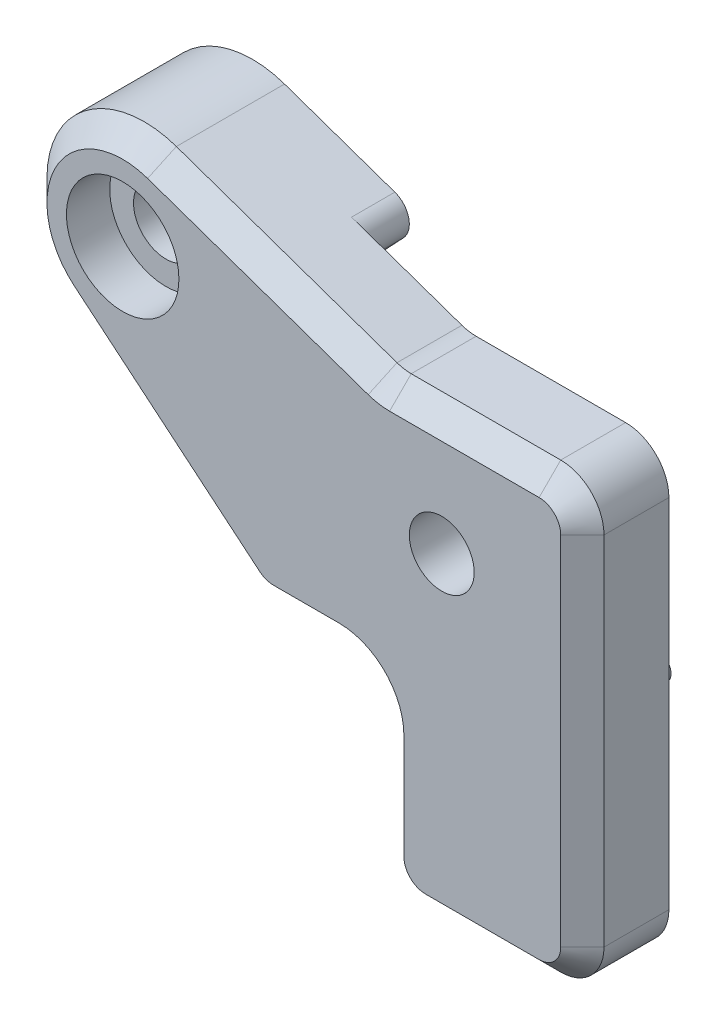
ISO-10303-21;
HEADER;
FILE_DESCRIPTION(('STEP AP214'),'2;1');
FILE_NAME('part.step','',(''),(''),'','','');
FILE_SCHEMA(('AUTOMOTIVE_DESIGN { 1 0 10303 214 1 1 1 1 }'));
ENDSEC;
DATA;
#1=APPLICATION_CONTEXT('core data for automotive mechanical design processes');
#2=APPLICATION_PROTOCOL_DEFINITION('international standard','automotive_design',2000,#1);
#3=PRODUCT_CONTEXT('',#1,'mechanical');
#4=PRODUCT('Part','Part','',(#3));
#5=PRODUCT_RELATED_PRODUCT_CATEGORY('part','',(#4));
#6=PRODUCT_DEFINITION_FORMATION('','',#4);
#7=PRODUCT_DEFINITION_CONTEXT('part definition',#1,'design');
#8=PRODUCT_DEFINITION('design','',#6,#7);
#9=PRODUCT_DEFINITION_SHAPE('','',#8);
#10=(LENGTH_UNIT() NAMED_UNIT(*) SI_UNIT(.MILLI.,.METRE.));
#11=(NAMED_UNIT(*) PLANE_ANGLE_UNIT() SI_UNIT($,.RADIAN.));
#12=(NAMED_UNIT(*) SI_UNIT($,.STERADIAN.) SOLID_ANGLE_UNIT());
#13=UNCERTAINTY_MEASURE_WITH_UNIT(LENGTH_MEASURE(1.E-05),#10,'distance_accuracy_value','');
#14=(GEOMETRIC_REPRESENTATION_CONTEXT(3) GLOBAL_UNCERTAINTY_ASSIGNED_CONTEXT((#13)) GLOBAL_UNIT_ASSIGNED_CONTEXT((#10,
#11,#12)) REPRESENTATION_CONTEXT('',''));
#15=CARTESIAN_POINT('',(0.,0.,0.));
#16=DIRECTION('',(0.,0.,1.));
#17=DIRECTION('',(1.,0.,0.));
#18=AXIS2_PLACEMENT_3D('',#15,#16,#17);
#19=CARTESIAN_POINT('',(-14.75,4.91987298107757,-2.));
#20=DIRECTION('',(0.,0.,1.));
#21=DIRECTION('',(1.,0.,0.));
#22=AXIS2_PLACEMENT_3D('',#19,#20,#21);
#23=PLANE('',#22);
#24=CARTESIAN_POINT('',(0.,0.,-2.));
#25=DIRECTION('',(0.,0.,1.));
#26=DIRECTION('',(1.,0.,0.));
#27=AXIS2_PLACEMENT_3D('',#24,#25,#26);
#28=CIRCLE('',#27,1.5);
#29=CARTESIAN_POINT('',(1.5,0.,-2.));
#30=VERTEX_POINT('',#29);
#31=EDGE_CURVE('E246',#30,#30,#28,.T.);
#32=ORIENTED_EDGE('',*,*,#31,.T.);
#33=EDGE_LOOP('',(#32));
#34=FACE_BOUND('',#33,.T.);
#35=CARTESIAN_POINT('',(0.,-9.5,-2.));
#36=DIRECTION('',(0.,0.,1.));
#37=DIRECTION('',(1.,0.,0.));
#38=AXIS2_PLACEMENT_3D('',#35,#36,#37);
#39=CIRCLE('',#38,1.);
#40=CARTESIAN_POINT('',(0.999999999999999,-9.5,-2.));
#41=VERTEX_POINT('',#40);
#42=EDGE_CURVE('E370',#41,#41,#39,.F.);
#43=ORIENTED_EDGE('',*,*,#42,.F.);
#44=EDGE_LOOP('',(#43));
#45=FACE_BOUND('',#44,.T.);
#46=CARTESIAN_POINT('',(-8.49825923351737,6.44598817624583,-2.));
#47=DIRECTION('',(0.,0.,-1.));
#48=DIRECTION('',(-1.,0.,0.));
#49=AXIS2_PLACEMENT_3D('',#46,#47,#48);
#50=CIRCLE('',#49,1.);
#51=CARTESIAN_POINT('',(-8.16890588709765,7.39019491907397,-2.));
#52=VERTEX_POINT('',#51);
#53=CARTESIAN_POINT('',(-7.77089418944463,5.75973742567352,-2.));
#54=VERTEX_POINT('',#53);
#55=EDGE_CURVE('E211',#52,#54,#50,.T.);
#56=ORIENTED_EDGE('',*,*,#55,.F.);
#57=DIRECTION('',(-0.944206742828144,0.32935334641972,0.));
#58=VECTOR('',#57,1.);
#59=CARTESIAN_POINT('',(-13.2679099411113,9.16880332380422,-2.));
#60=LINE('',#59,#58);
#61=CARTESIAN_POINT('',(-3.06990183308403,5.61158651434373,-2.));
#62=VERTEX_POINT('',#61);
#63=EDGE_CURVE('E255',#62,#52,#60,.T.);
#64=ORIENTED_EDGE('',*,*,#63,.F.);
#65=CARTESIAN_POINT('',(-2.41119514024459,7.50000000000002,-2.));
#66=DIRECTION('',(0.,0.,1.));
#67=DIRECTION('',(1.,0.,0.));
#68=AXIS2_PLACEMENT_3D('',#65,#66,#67);
#69=CIRCLE('',#68,2.);
#70=CARTESIAN_POINT('',(-2.41119514024459,5.50000000000002,-2.));
#71=VERTEX_POINT('',#70);
#72=EDGE_CURVE('E310',#62,#71,#69,.T.);
#73=ORIENTED_EDGE('',*,*,#72,.T.);
#74=DIRECTION('',(-1.,0.,0.));
#75=VECTOR('',#74,1.);
#76=CARTESIAN_POINT('',(6.49999999999998,5.50000000000002,-2.));
#77=LINE('',#76,#75);
#78=CARTESIAN_POINT('',(4.49999999999998,5.50000000000002,-2.));
#79=VERTEX_POINT('',#78);
#80=EDGE_CURVE('E252',#79,#71,#77,.T.);
#81=ORIENTED_EDGE('',*,*,#80,.F.);
#82=CARTESIAN_POINT('',(4.49999999999998,3.50000000000002,-2.));
#83=DIRECTION('',(0.,0.,1.));
#84=DIRECTION('',(1.,0.,0.));
#85=AXIS2_PLACEMENT_3D('',#82,#83,#84);
#86=CIRCLE('',#85,2.);
#87=CARTESIAN_POINT('',(6.49999999999998,3.50000000000002,-2.));
#88=VERTEX_POINT('',#87);
#89=EDGE_CURVE('E285',#79,#88,#86,.F.);
#90=ORIENTED_EDGE('',*,*,#89,.T.);
#91=DIRECTION('',(0.,1.,0.));
#92=VECTOR('',#91,1.);
#93=CARTESIAN_POINT('',(6.49999999999998,-15.,-2.));
#94=LINE('',#93,#92);
#95=CARTESIAN_POINT('',(6.49999999999998,-13.,-2.));
#96=VERTEX_POINT('',#95);
#97=EDGE_CURVE('E249',#96,#88,#94,.T.);
#98=ORIENTED_EDGE('',*,*,#97,.F.);
#99=CARTESIAN_POINT('',(4.49999999999998,-13.,-2.));
#100=DIRECTION('',(0.,0.,1.));
#101=DIRECTION('',(1.,0.,0.));
#102=AXIS2_PLACEMENT_3D('',#99,#100,#101);
#103=CIRCLE('',#102,2.);
#104=CARTESIAN_POINT('',(4.49999999999998,-15.,-2.));
#105=VERTEX_POINT('',#104);
#106=EDGE_CURVE('E289',#96,#105,#103,.F.);
#107=ORIENTED_EDGE('',*,*,#106,.T.);
#108=DIRECTION('',(1.,0.,0.));
#109=VECTOR('',#108,1.);
#110=CARTESIAN_POINT('',(6.49999999999998,-15.,-2.));
#111=LINE('',#110,#109);
#112=CARTESIAN_POINT('',(-0.750000000000016,-15.,-2.));
#113=VERTEX_POINT('',#112);
#114=EDGE_CURVE('E267',#113,#105,#111,.T.);
#115=ORIENTED_EDGE('',*,*,#114,.F.);
#116=CARTESIAN_POINT('',(-0.750000000000016,-13.,-2.));
#117=DIRECTION('',(0.,0.,1.));
#118=DIRECTION('',(1.,0.,0.));
#119=AXIS2_PLACEMENT_3D('',#116,#117,#118);
#120=CIRCLE('',#119,2.);
#121=CARTESIAN_POINT('',(-2.75000000000002,-13.,-2.));
#122=VERTEX_POINT('',#121);
#123=EDGE_CURVE('E283',#113,#122,#120,.F.);
#124=ORIENTED_EDGE('',*,*,#123,.T.);
#125=DIRECTION('',(0.,-1.,0.));
#126=VECTOR('',#125,1.);
#127=CARTESIAN_POINT('',(-2.75000000000002,-15.,-2.));
#128=LINE('',#127,#126);
#129=CARTESIAN_POINT('',(-2.75000000000002,-8.14999999999998,-2.));
#130=VERTEX_POINT('',#129);
#131=EDGE_CURVE('E264',#130,#122,#128,.T.);
#132=ORIENTED_EDGE('',*,*,#131,.F.);
#133=CARTESIAN_POINT('',(-4.75000000000002,-8.14999999999998,-2.));
#134=DIRECTION('',(0.,0.,1.));
#135=DIRECTION('',(1.,0.,0.));
#136=AXIS2_PLACEMENT_3D('',#133,#134,#135);
#137=CIRCLE('',#136,2.);
#138=CARTESIAN_POINT('',(-4.75000000000002,-6.14999999999998,-2.));
#139=VERTEX_POINT('',#138);
#140=EDGE_CURVE('E312',#130,#139,#137,.T.);
#141=ORIENTED_EDGE('',*,*,#140,.T.);
#142=DIRECTION('',(1.,0.,0.));
#143=VECTOR('',#142,1.);
#144=CARTESIAN_POINT('',(-8.50000000000002,-6.14999999999998,-2.));
#145=LINE('',#144,#143);
#146=CARTESIAN_POINT('',(-7.77561855395976,-6.14999999999998,-2.));
#147=VERTEX_POINT('',#146);
#148=EDGE_CURVE('E261',#147,#139,#145,.T.);
#149=ORIENTED_EDGE('',*,*,#148,.F.);
#150=CARTESIAN_POINT('',(-7.77561855395976,-4.14999999999998,-2.));
#151=DIRECTION('',(0.,0.,1.));
#152=DIRECTION('',(1.,0.,0.));
#153=AXIS2_PLACEMENT_3D('',#150,#151,#152);
#154=CIRCLE('',#153,2.);
#155=CARTESIAN_POINT('',(-9.05636978461311,-5.68612378576073,-2.));
#156=VERTEX_POINT('',#155);
#157=EDGE_CURVE('E287',#147,#156,#154,.F.);
#158=ORIENTED_EDGE('',*,*,#157,.T.);
#159=DIRECTION('',(0.768061892880373,-0.640375615326675,0.));
#160=VECTOR('',#159,1.);
#161=CARTESIAN_POINT('',(-17.6316902689701,1.46359446311589,-2.));
#162=LINE('',#161,#160);
#163=CARTESIAN_POINT('',(-17.6316902689701,1.46359446311589,-2.));
#164=VERTEX_POINT('',#163);
#165=EDGE_CURVE('E258',#164,#156,#162,.T.);
#166=ORIENTED_EDGE('',*,*,#165,.F.);
#167=CARTESIAN_POINT('',(-14.75,4.91987298107757,-2.));
#168=DIRECTION('',(0.,0.,-1.));
#169=DIRECTION('',(-1.,0.,0.));
#170=AXIS2_PLACEMENT_3D('',#167,#168,#169);
#171=CIRCLE('',#170,4.5);
#172=CARTESIAN_POINT('',(-11.4768573016727,1.83174460350219,-2.));
#173=VERTEX_POINT('',#172);
#174=EDGE_CURVE('E219',#173,#164,#171,.T.);
#175=ORIENTED_EDGE('',*,*,#174,.F.);
#176=DIRECTION('',(-0.686250750572307,-0.727365044072745,0.));
#177=VECTOR('',#176,1.);
#178=CARTESIAN_POINT('',(-7.77089418944463,5.75973742567352,-2.));
#179=LINE('',#178,#177);
#180=EDGE_CURVE('E217',#54,#173,#179,.T.);
#181=ORIENTED_EDGE('',*,*,#180,.F.);
#182=EDGE_LOOP('',(#56,#64,#73,#81,#90,#98,#107,#115,#124,#132,#141,#149,#158,#166,#175,#181));
#183=FACE_BOUND('',#182,.T.);
#184=ADVANCED_FACE('F36',(#34,#45,#183),#23,.F.);
#185=CARTESIAN_POINT('',(-14.75,4.91987298107757,0.));
#186=DIRECTION('',(0.,0.,1.));
#187=DIRECTION('',(1.,0.,0.));
#188=AXIS2_PLACEMENT_3D('',#185,#186,#187);
#189=PLANE('',#188);
#190=CARTESIAN_POINT('',(-14.75,4.91987298107757,0.));
#191=DIRECTION('',(0.,0.,1.));
#192=DIRECTION('',(1.,0.,0.));
#193=AXIS2_PLACEMENT_3D('',#190,#191,#192);
#194=CIRCLE('',#193,1.5);
#195=CARTESIAN_POINT('',(-13.25,4.91987298107757,0.));
#196=VERTEX_POINT('',#195);
#197=EDGE_CURVE('E243',#196,#196,#194,.T.);
#198=ORIENTED_EDGE('',*,*,#197,.F.);
#199=EDGE_LOOP('',(#198));
#200=FACE_BOUND('',#199,.T.);
#201=CARTESIAN_POINT('',(-14.75,4.91987298107757,0.));
#202=DIRECTION('',(0.,0.,1.));
#203=DIRECTION('',(1.,0.,0.));
#204=AXIS2_PLACEMENT_3D('',#201,#202,#203);
#205=CIRCLE('',#204,2.6);
#206=CARTESIAN_POINT('',(-12.15,4.91987298107757,0.));
#207=VERTEX_POINT('',#206);
#208=EDGE_CURVE('E237',#207,#207,#205,.T.);
#209=ORIENTED_EDGE('',*,*,#208,.T.);
#210=EDGE_LOOP('',(#209));
#211=FACE_BOUND('',#210,.T.);
#212=ADVANCED_FACE('F428',(#200,#211),#189,.T.);
#213=CARTESIAN_POINT('',(6.49999999999998,-15.,-2.));
#214=DIRECTION('',(1.,0.,0.));
#215=DIRECTION('',(0.,0.,-1.));
#216=AXIS2_PLACEMENT_3D('',#213,#214,#215);
#217=PLANE('',#216);
#218=DIRECTION('',(0.,0.,1.));
#219=VECTOR('',#218,1.);
#220=CARTESIAN_POINT('',(6.49999999999998,3.50000000000002,-2.));
#221=LINE('',#220,#219);
#222=CARTESIAN_POINT('',(6.49999999999998,3.50000000000002,1.));
#223=VERTEX_POINT('',#222);
#224=EDGE_CURVE('E278',#88,#223,#221,.T.);
#225=ORIENTED_EDGE('',*,*,#224,.T.);
#226=DIRECTION('',(0.,-1.,0.));
#227=VECTOR('',#226,1.);
#228=CARTESIAN_POINT('',(6.49999999999998,-15.,1.));
#229=LINE('',#228,#227);
#230=CARTESIAN_POINT('',(6.49999999999998,-13.,1.));
#231=VERTEX_POINT('',#230);
#232=EDGE_CURVE('E350',#223,#231,#229,.T.);
#233=ORIENTED_EDGE('',*,*,#232,.T.);
#234=DIRECTION('',(0.,0.,1.));
#235=VECTOR('',#234,1.);
#236=CARTESIAN_POINT('',(6.49999999999998,-13.,-2.));
#237=LINE('',#236,#235);
#238=EDGE_CURVE('E281',#231,#96,#237,.F.);
#239=ORIENTED_EDGE('',*,*,#238,.T.);
#240=ORIENTED_EDGE('',*,*,#97,.T.);
#241=EDGE_LOOP('',(#225,#233,#239,#240));
#242=FACE_BOUND('',#241,.T.);
#243=ADVANCED_FACE('F434',(#242),#217,.T.);
#244=CARTESIAN_POINT('',(6.49999999999998,-15.,-2.));
#245=DIRECTION('',(0.,-1.,0.));
#246=DIRECTION('',(0.,0.,-1.));
#247=AXIS2_PLACEMENT_3D('',#244,#245,#246);
#248=PLANE('',#247);
#249=DIRECTION('',(0.,0.,1.));
#250=VECTOR('',#249,1.);
#251=CARTESIAN_POINT('',(4.49999999999998,-15.,-2.));
#252=LINE('',#251,#250);
#253=CARTESIAN_POINT('',(4.49999999999998,-15.,1.));
#254=VERTEX_POINT('',#253);
#255=EDGE_CURVE('E275',#105,#254,#252,.T.);
#256=ORIENTED_EDGE('',*,*,#255,.T.);
#257=DIRECTION('',(-1.,0.,0.));
#258=VECTOR('',#257,1.);
#259=CARTESIAN_POINT('',(6.49999999999998,-15.,1.));
#260=LINE('',#259,#258);
#261=CARTESIAN_POINT('',(-0.750000000000016,-15.,1.));
#262=VERTEX_POINT('',#261);
#263=EDGE_CURVE('E343',#254,#262,#260,.T.);
#264=ORIENTED_EDGE('',*,*,#263,.T.);
#265=DIRECTION('',(0.,0.,1.));
#266=VECTOR('',#265,1.);
#267=CARTESIAN_POINT('',(-0.750000000000016,-15.,-2.));
#268=LINE('',#267,#266);
#269=EDGE_CURVE('E272',#262,#113,#268,.F.);
#270=ORIENTED_EDGE('',*,*,#269,.T.);
#271=ORIENTED_EDGE('',*,*,#114,.T.);
#272=EDGE_LOOP('',(#256,#264,#270,#271));
#273=FACE_BOUND('',#272,.T.);
#274=ADVANCED_FACE('F442',(#273),#248,.T.);
#275=CARTESIAN_POINT('',(-2.75000000000002,-15.,-2.));
#276=DIRECTION('',(-1.,0.,0.));
#277=DIRECTION('',(0.,0.,1.));
#278=AXIS2_PLACEMENT_3D('',#275,#276,#277);
#279=PLANE('',#278);
#280=DIRECTION('',(0.,0.,1.));
#281=VECTOR('',#280,1.);
#282=CARTESIAN_POINT('',(-2.75000000000002,-13.,-2.));
#283=LINE('',#282,#281);
#284=CARTESIAN_POINT('',(-2.75000000000002,-13.,1.));
#285=VERTEX_POINT('',#284);
#286=EDGE_CURVE('E307',#122,#285,#283,.T.);
#287=ORIENTED_EDGE('',*,*,#286,.T.);
#288=DIRECTION('',(0.,1.,0.));
#289=VECTOR('',#288,1.);
#290=CARTESIAN_POINT('',(-2.75000000000002,-15.,1.));
#291=LINE('',#290,#289);
#292=CARTESIAN_POINT('',(-2.75000000000002,-8.14999999999998,1.));
#293=VERTEX_POINT('',#292);
#294=EDGE_CURVE('E352',#285,#293,#291,.T.);
#295=ORIENTED_EDGE('',*,*,#294,.T.);
#296=DIRECTION('',(0.,0.,1.));
#297=VECTOR('',#296,1.);
#298=CARTESIAN_POINT('',(-2.75000000000002,-8.14999999999998,-2.));
#299=LINE('',#298,#297);
#300=EDGE_CURVE('E305',#293,#130,#299,.F.);
#301=ORIENTED_EDGE('',*,*,#300,.T.);
#302=ORIENTED_EDGE('',*,*,#131,.T.);
#303=EDGE_LOOP('',(#287,#295,#301,#302));
#304=FACE_BOUND('',#303,.T.);
#305=ADVANCED_FACE('F445',(#304),#279,.T.);
#306=CARTESIAN_POINT('',(-8.50000000000002,-6.14999999999998,-2.));
#307=DIRECTION('',(0.,-1.,0.));
#308=DIRECTION('',(1.,0.,0.));
#309=AXIS2_PLACEMENT_3D('',#306,#307,#308);
#310=PLANE('',#309);
#311=DIRECTION('',(0.,0.,1.));
#312=VECTOR('',#311,1.);
#313=CARTESIAN_POINT('',(-4.75000000000002,-6.14999999999998,0.));
#314=LINE('',#313,#312);
#315=CARTESIAN_POINT('',(-4.75000000000002,-6.14999999999998,1.));
#316=VERTEX_POINT('',#315);
#317=EDGE_CURVE('E293',#139,#316,#314,.T.);
#318=ORIENTED_EDGE('',*,*,#317,.T.);
#319=DIRECTION('',(-1.,0.,0.));
#320=VECTOR('',#319,1.);
#321=CARTESIAN_POINT('',(-8.50000000000002,-6.14999999999998,1.));
#322=LINE('',#321,#320);
#323=CARTESIAN_POINT('',(-7.77561855395976,-6.14999999999998,1.));
#324=VERTEX_POINT('',#323);
#325=EDGE_CURVE('E360',#316,#324,#322,.T.);
#326=ORIENTED_EDGE('',*,*,#325,.T.);
#327=DIRECTION('',(0.,0.,1.));
#328=VECTOR('',#327,1.);
#329=CARTESIAN_POINT('',(-7.77561855395976,-6.14999999999998,-2.));
#330=LINE('',#329,#328);
#331=EDGE_CURVE('E296',#324,#147,#330,.F.);
#332=ORIENTED_EDGE('',*,*,#331,.T.);
#333=ORIENTED_EDGE('',*,*,#148,.T.);
#334=EDGE_LOOP('',(#318,#326,#332,#333));
#335=FACE_BOUND('',#334,.T.);
#336=ADVANCED_FACE('F449',(#335),#310,.T.);
#337=CARTESIAN_POINT('',(-17.6316902689701,1.46359446311589,-2.));
#338=DIRECTION('',(-0.640375615326675,-0.768061892880373,0.));
#339=DIRECTION('',(0.768061892880373,-0.640375615326675,0.));
#340=AXIS2_PLACEMENT_3D('',#337,#338,#339);
#341=PLANE('',#340);
#342=DIRECTION('',(0.,0.,1.));
#343=VECTOR('',#342,1.);
#344=CARTESIAN_POINT('',(-9.05636978461312,-5.68612378576073,-2.));
#345=LINE('',#344,#343);
#346=CARTESIAN_POINT('',(-9.05636978461312,-5.68612378576073,0.999999999999999));
#347=VERTEX_POINT('',#346);
#348=EDGE_CURVE('E291',#156,#347,#345,.T.);
#349=ORIENTED_EDGE('',*,*,#348,.T.);
#350=DIRECTION('',(-0.768061892880373,0.640375615326675,0.));
#351=VECTOR('',#350,1.);
#352=CARTESIAN_POINT('',(-17.6316902689701,1.46359446311589,0.999999999999999));
#353=LINE('',#352,#351);
#354=CARTESIAN_POINT('',(-17.6316902689701,1.46359446311589,1.));
#355=VERTEX_POINT('',#354);
#356=EDGE_CURVE('E52',#347,#355,#353,.T.);
#357=ORIENTED_EDGE('',*,*,#356,.T.);
#358=DIRECTION('',(0.,0.,1.));
#359=VECTOR('',#358,1.);
#360=CARTESIAN_POINT('',(-17.6316902689701,1.46359446311589,-2.));
#361=LINE('',#360,#359);
#362=EDGE_CURVE('E270',#164,#355,#361,.T.);
#363=ORIENTED_EDGE('',*,*,#362,.F.);
#364=ORIENTED_EDGE('',*,*,#165,.T.);
#365=EDGE_LOOP('',(#349,#357,#363,#364));
#366=FACE_BOUND('',#365,.T.);
#367=ADVANCED_FACE('F453',(#366),#341,.T.);
#368=CARTESIAN_POINT('',(-14.75,4.91987298107757,-2.));
#369=DIRECTION('',(0.,0.,1.));
#370=DIRECTION('',(1.,0.,0.));
#371=AXIS2_PLACEMENT_3D('',#368,#369,#370);
#372=CYLINDRICAL_SURFACE('',#371,4.5);
#373=ORIENTED_EDGE('',*,*,#362,.T.);
#374=CARTESIAN_POINT('',(-14.75,4.91987298107757,1.));
#375=DIRECTION('',(0.,0.,1.));
#376=DIRECTION('',(1.,0.,0.));
#377=AXIS2_PLACEMENT_3D('',#374,#375,#376);
#378=CIRCLE('',#377,4.5);
#379=CARTESIAN_POINT('',(-13.2679099411113,9.16880332380422,1.));
#380=VERTEX_POINT('',#379);
#381=EDGE_CURVE('E59',#355,#380,#378,.F.);
#382=ORIENTED_EDGE('',*,*,#381,.T.);
#383=DIRECTION('',(0.,0.,1.));
#384=VECTOR('',#383,1.);
#385=CARTESIAN_POINT('',(-13.2679099411113,9.16880332380422,-2.));
#386=LINE('',#385,#384);
#387=CARTESIAN_POINT('',(-13.2679099411113,9.16880332380422,-4.));
#388=VERTEX_POINT('',#387);
#389=EDGE_CURVE('E222',#388,#380,#386,.T.);
#390=ORIENTED_EDGE('',*,*,#389,.F.);
#391=CARTESIAN_POINT('',(-14.75,4.91987298107757,-4.));
#392=DIRECTION('',(0.,0.,1.));
#393=DIRECTION('',(1.,0.,0.));
#394=AXIS2_PLACEMENT_3D('',#391,#392,#393);
#395=CIRCLE('',#394,4.5);
#396=CARTESIAN_POINT('',(-11.4768573016727,1.83174460350219,-4.));
#397=VERTEX_POINT('',#396);
#398=EDGE_CURVE('E204',#388,#397,#395,.T.);
#399=ORIENTED_EDGE('',*,*,#398,.T.);
#400=DIRECTION('',(0.,0.,1.));
#401=VECTOR('',#400,1.);
#402=CARTESIAN_POINT('',(-11.4768573016727,1.83174460350219,-24.8021421099316));
#403=LINE('',#402,#401);
#404=EDGE_CURVE('E214',#397,#173,#403,.T.);
#405=ORIENTED_EDGE('',*,*,#404,.T.);
#406=ORIENTED_EDGE('',*,*,#174,.T.);
#407=EDGE_LOOP('',(#373,#382,#390,#399,#405,#406));
#408=FACE_BOUND('',#407,.T.);
#409=ADVANCED_FACE('F221',(#408),#372,.T.);
#410=CARTESIAN_POINT('',(-13.2679099411113,9.16880332380422,-2.));
#411=DIRECTION('',(0.32935334641972,0.944206742828144,0.));
#412=DIRECTION('',(-0.944206742828144,0.32935334641972,0.));
#413=AXIS2_PLACEMENT_3D('',#410,#411,#412);
#414=PLANE('',#413);
#415=ORIENTED_EDGE('',*,*,#389,.T.);
#416=DIRECTION('',(0.944206742828144,-0.32935334641972,0.));
#417=VECTOR('',#416,1.);
#418=CARTESIAN_POINT('',(-13.2679099411113,9.16880332380422,1.));
#419=LINE('',#418,#417);
#420=CARTESIAN_POINT('',(-3.06990183308403,5.61158651434373,1.));
#421=VERTEX_POINT('',#420);
#422=EDGE_CURVE('E366',#380,#421,#419,.T.);
#423=ORIENTED_EDGE('',*,*,#422,.T.);
#424=DIRECTION('',(0.,0.,1.));
#425=VECTOR('',#424,1.);
#426=CARTESIAN_POINT('',(-3.06990183308403,5.61158651434373,-2.));
#427=LINE('',#426,#425);
#428=EDGE_CURVE('E303',#421,#62,#427,.F.);
#429=ORIENTED_EDGE('',*,*,#428,.T.);
#430=ORIENTED_EDGE('',*,*,#63,.T.);
#431=DIRECTION('',(0.,0.,1.));
#432=VECTOR('',#431,1.);
#433=CARTESIAN_POINT('',(-8.16890588709765,7.39019491907397,-24.8021421099316));
#434=LINE('',#433,#432);
#435=CARTESIAN_POINT('',(-8.16890588709765,7.39019491907397,-4.));
#436=VERTEX_POINT('',#435);
#437=EDGE_CURVE('E671',#436,#52,#434,.T.);
#438=ORIENTED_EDGE('',*,*,#437,.F.);
#439=DIRECTION('',(-0.944206742828144,0.32935334641972,0.));
#440=VECTOR('',#439,1.);
#441=CARTESIAN_POINT('',(-13.2679099411113,9.16880332380422,-4.));
#442=LINE('',#441,#440);
#443=EDGE_CURVE('E227',#436,#388,#442,.T.);
#444=ORIENTED_EDGE('',*,*,#443,.T.);
#445=EDGE_LOOP('',(#415,#423,#429,#430,#438,#444));
#446=FACE_BOUND('',#445,.T.);
#447=ADVANCED_FACE('F459',(#446),#414,.T.);
#448=CARTESIAN_POINT('',(6.49999999999998,5.50000000000002,-2.));
#449=DIRECTION('',(0.,1.,0.));
#450=DIRECTION('',(-1.,0.,0.));
#451=AXIS2_PLACEMENT_3D('',#448,#449,#450);
#452=PLANE('',#451);
#453=DIRECTION('',(0.,0.,1.));
#454=VECTOR('',#453,1.);
#455=CARTESIAN_POINT('',(-2.41119514024459,5.50000000000002,0.));
#456=LINE('',#455,#454);
#457=CARTESIAN_POINT('',(-2.41119514024459,5.50000000000002,1.));
#458=VERTEX_POINT('',#457);
#459=EDGE_CURVE('E300',#71,#458,#456,.T.);
#460=ORIENTED_EDGE('',*,*,#459,.T.);
#461=DIRECTION('',(1.,0.,0.));
#462=VECTOR('',#461,1.);
#463=CARTESIAN_POINT('',(6.49999999999998,5.50000000000002,1.));
#464=LINE('',#463,#462);
#465=CARTESIAN_POINT('',(4.49999999999998,5.50000000000002,1.));
#466=VERTEX_POINT('',#465);
#467=EDGE_CURVE('E358',#458,#466,#464,.T.);
#468=ORIENTED_EDGE('',*,*,#467,.T.);
#469=DIRECTION('',(0.,0.,1.));
#470=VECTOR('',#469,1.);
#471=CARTESIAN_POINT('',(4.49999999999998,5.50000000000002,-2.));
#472=LINE('',#471,#470);
#473=EDGE_CURVE('E298',#466,#79,#472,.F.);
#474=ORIENTED_EDGE('',*,*,#473,.T.);
#475=ORIENTED_EDGE('',*,*,#80,.T.);
#476=EDGE_LOOP('',(#460,#468,#474,#475));
#477=FACE_BOUND('',#476,.T.);
#478=ADVANCED_FACE('F462',(#477),#452,.T.);
#479=CARTESIAN_POINT('',(0.,0.,-2.));
#480=DIRECTION('',(0.,0.,1.));
#481=DIRECTION('',(1.,0.,0.));
#482=AXIS2_PLACEMENT_3D('',#479,#480,#481);
#483=CYLINDRICAL_SURFACE('',#482,1.5);
#484=ORIENTED_EDGE('',*,*,#31,.F.);
#485=EDGE_LOOP('',(#484));
#486=FACE_BOUND('',#485,.T.);
#487=CARTESIAN_POINT('',(0.,0.,2.));
#488=DIRECTION('',(0.,0.,1.));
#489=DIRECTION('',(1.,0.,0.));
#490=AXIS2_PLACEMENT_3D('',#487,#488,#489);
#491=CIRCLE('',#490,1.5);
#492=CARTESIAN_POINT('',(1.5,0.,2.));
#493=VERTEX_POINT('',#492);
#494=EDGE_CURVE('E236',#493,#493,#491,.T.);
#495=ORIENTED_EDGE('',*,*,#494,.T.);
#496=EDGE_LOOP('',(#495));
#497=FACE_BOUND('',#496,.T.);
#498=ADVANCED_FACE('F439',(#486,#497),#483,.F.);
#499=CARTESIAN_POINT('',(-14.75,4.91987298107757,-2.));
#500=DIRECTION('',(0.,0.,1.));
#501=DIRECTION('',(1.,0.,0.));
#502=AXIS2_PLACEMENT_3D('',#499,#500,#501);
#503=CYLINDRICAL_SURFACE('',#502,1.5);
#504=ORIENTED_EDGE('',*,*,#197,.T.);
#505=EDGE_LOOP('',(#504));
#506=FACE_BOUND('',#505,.T.);
#507=CARTESIAN_POINT('',(-14.75,4.91987298107757,-4.));
#508=DIRECTION('',(0.,0.,1.));
#509=DIRECTION('',(1.,0.,0.));
#510=AXIS2_PLACEMENT_3D('',#507,#508,#509);
#511=CIRCLE('',#510,1.5);
#512=CARTESIAN_POINT('',(-13.25,4.91987298107757,-4.));
#513=VERTEX_POINT('',#512);
#514=EDGE_CURVE('E229',#513,#513,#511,.T.);
#515=ORIENTED_EDGE('',*,*,#514,.F.);
#516=EDGE_LOOP('',(#515));
#517=FACE_BOUND('',#516,.T.);
#518=ADVANCED_FACE('F474',(#506,#517),#503,.F.);
#519=CARTESIAN_POINT('',(4.49999999999998,-13.,-2.));
#520=DIRECTION('',(0.,0.,1.));
#521=DIRECTION('',(1.,0.,0.));
#522=AXIS2_PLACEMENT_3D('',#519,#520,#521);
#523=CYLINDRICAL_SURFACE('',#522,2.);
#524=ORIENTED_EDGE('',*,*,#238,.F.);
#525=CARTESIAN_POINT('',(4.49999999999998,-13.,1.));
#526=DIRECTION('',(0.,0.,1.));
#527=DIRECTION('',(1.,0.,0.));
#528=AXIS2_PLACEMENT_3D('',#525,#526,#527);
#529=CIRCLE('',#528,2.);
#530=EDGE_CURVE('E346',#231,#254,#529,.F.);
#531=ORIENTED_EDGE('',*,*,#530,.T.);
#532=ORIENTED_EDGE('',*,*,#255,.F.);
#533=ORIENTED_EDGE('',*,*,#106,.F.);
#534=EDGE_LOOP('',(#524,#531,#532,#533));
#535=FACE_BOUND('',#534,.T.);
#536=ADVANCED_FACE('F470',(#535),#523,.T.);
#537=CARTESIAN_POINT('',(-7.77561855395976,-4.14999999999998,-2.));
#538=DIRECTION('',(0.,0.,1.));
#539=DIRECTION('',(1.,0.,0.));
#540=AXIS2_PLACEMENT_3D('',#537,#538,#539);
#541=CYLINDRICAL_SURFACE('',#540,2.);
#542=ORIENTED_EDGE('',*,*,#331,.F.);
#543=CARTESIAN_POINT('',(-7.77561855395976,-4.14999999999998,1.));
#544=DIRECTION('',(0.,0.,1.));
#545=DIRECTION('',(1.,0.,0.));
#546=AXIS2_PLACEMENT_3D('',#543,#544,#545);
#547=CIRCLE('',#546,2.);
#548=EDGE_CURVE('E364',#324,#347,#547,.F.);
#549=ORIENTED_EDGE('',*,*,#548,.T.);
#550=ORIENTED_EDGE('',*,*,#348,.F.);
#551=ORIENTED_EDGE('',*,*,#157,.F.);
#552=EDGE_LOOP('',(#542,#549,#550,#551));
#553=FACE_BOUND('',#552,.T.);
#554=ADVANCED_FACE('F473',(#553),#541,.T.);
#555=CARTESIAN_POINT('',(-2.41119514024459,7.50000000000002,-2.));
#556=DIRECTION('',(0.,0.,-1.));
#557=DIRECTION('',(-1.,0.,0.));
#558=AXIS2_PLACEMENT_3D('',#555,#556,#557);
#559=CYLINDRICAL_SURFACE('',#558,2.);
#560=ORIENTED_EDGE('',*,*,#428,.F.);
#561=CARTESIAN_POINT('',(-2.41119514024459,7.50000000000002,1.));
#562=DIRECTION('',(0.,0.,1.));
#563=DIRECTION('',(1.,0.,0.));
#564=AXIS2_PLACEMENT_3D('',#561,#562,#563);
#565=CIRCLE('',#564,2.);
#566=EDGE_CURVE('E362',#421,#458,#565,.T.);
#567=ORIENTED_EDGE('',*,*,#566,.T.);
#568=ORIENTED_EDGE('',*,*,#459,.F.);
#569=ORIENTED_EDGE('',*,*,#72,.F.);
#570=EDGE_LOOP('',(#560,#567,#568,#569));
#571=FACE_BOUND('',#570,.T.);
#572=ADVANCED_FACE('F478',(#571),#559,.F.);
#573=CARTESIAN_POINT('',(4.49999999999998,3.50000000000002,-2.));
#574=DIRECTION('',(0.,0.,1.));
#575=DIRECTION('',(1.,0.,0.));
#576=AXIS2_PLACEMENT_3D('',#573,#574,#575);
#577=CYLINDRICAL_SURFACE('',#576,2.);
#578=ORIENTED_EDGE('',*,*,#473,.F.);
#579=CARTESIAN_POINT('',(4.49999999999998,3.50000000000002,1.));
#580=DIRECTION('',(0.,0.,1.));
#581=DIRECTION('',(1.,0.,0.));
#582=AXIS2_PLACEMENT_3D('',#579,#580,#581);
#583=CIRCLE('',#582,2.);
#584=EDGE_CURVE('E354',#466,#223,#583,.F.);
#585=ORIENTED_EDGE('',*,*,#584,.T.);
#586=ORIENTED_EDGE('',*,*,#224,.F.);
#587=ORIENTED_EDGE('',*,*,#89,.F.);
#588=EDGE_LOOP('',(#578,#585,#586,#587));
#589=FACE_BOUND('',#588,.T.);
#590=ADVANCED_FACE('F482',(#589),#577,.T.);
#591=CARTESIAN_POINT('',(-0.750000000000016,-13.,-2.));
#592=DIRECTION('',(0.,0.,1.));
#593=DIRECTION('',(1.,0.,0.));
#594=AXIS2_PLACEMENT_3D('',#591,#592,#593);
#595=CYLINDRICAL_SURFACE('',#594,2.);
#596=ORIENTED_EDGE('',*,*,#269,.F.);
#597=CARTESIAN_POINT('',(-0.750000000000016,-13.,1.));
#598=DIRECTION('',(0.,0.,1.));
#599=DIRECTION('',(1.,0.,0.));
#600=AXIS2_PLACEMENT_3D('',#597,#598,#599);
#601=CIRCLE('',#600,2.);
#602=EDGE_CURVE('E348',#262,#285,#601,.F.);
#603=ORIENTED_EDGE('',*,*,#602,.T.);
#604=ORIENTED_EDGE('',*,*,#286,.F.);
#605=ORIENTED_EDGE('',*,*,#123,.F.);
#606=EDGE_LOOP('',(#596,#603,#604,#605));
#607=FACE_BOUND('',#606,.T.);
#608=ADVANCED_FACE('F486',(#607),#595,.T.);
#609=CARTESIAN_POINT('',(-4.75000000000002,-8.14999999999998,-2.));
#610=DIRECTION('',(0.,0.,-1.));
#611=DIRECTION('',(-1.,0.,0.));
#612=AXIS2_PLACEMENT_3D('',#609,#610,#611);
#613=CYLINDRICAL_SURFACE('',#612,2.);
#614=ORIENTED_EDGE('',*,*,#300,.F.);
#615=CARTESIAN_POINT('',(-4.75000000000002,-8.14999999999998,1.));
#616=DIRECTION('',(0.,0.,1.));
#617=DIRECTION('',(1.,0.,0.));
#618=AXIS2_PLACEMENT_3D('',#615,#616,#617);
#619=CIRCLE('',#618,2.);
#620=EDGE_CURVE('E356',#293,#316,#619,.T.);
#621=ORIENTED_EDGE('',*,*,#620,.T.);
#622=ORIENTED_EDGE('',*,*,#317,.F.);
#623=ORIENTED_EDGE('',*,*,#140,.F.);
#624=EDGE_LOOP('',(#614,#621,#622,#623));
#625=FACE_BOUND('',#624,.T.);
#626=ADVANCED_FACE('F490',(#625),#613,.F.);
#627=CARTESIAN_POINT('',(-0.750000000000016,-13.,2.));
#628=DIRECTION('',(0.,0.,1.));
#629=DIRECTION('',(1.,0.,0.));
#630=AXIS2_PLACEMENT_3D('',#627,#628,#629);
#631=PLANE('',#630);
#632=CARTESIAN_POINT('',(-0.750000000000016,-13.,2.));
#633=DIRECTION('',(0.,0.,1.));
#634=DIRECTION('',(1.,0.,0.));
#635=AXIS2_PLACEMENT_3D('',#632,#633,#634);
#636=CIRCLE('',#635,1.);
#637=CARTESIAN_POINT('',(-1.75000000000002,-13.,2.));
#638=VERTEX_POINT('',#637);
#639=CARTESIAN_POINT('',(-0.750000000000016,-14.,2.));
#640=VERTEX_POINT('',#639);
#641=EDGE_CURVE('E336',#638,#640,#636,.T.);
#642=ORIENTED_EDGE('',*,*,#641,.T.);
#643=DIRECTION('',(1.,0.,0.));
#644=VECTOR('',#643,1.);
#645=CARTESIAN_POINT('',(-0.750000000000016,-14.,2.));
#646=LINE('',#645,#644);
#647=CARTESIAN_POINT('',(4.49999999999998,-14.,2.));
#648=VERTEX_POINT('',#647);
#649=EDGE_CURVE('E340',#640,#648,#646,.T.);
#650=ORIENTED_EDGE('',*,*,#649,.T.);
#651=CARTESIAN_POINT('',(4.49999999999998,-13.,2.));
#652=DIRECTION('',(0.,0.,1.));
#653=DIRECTION('',(1.,0.,0.));
#654=AXIS2_PLACEMENT_3D('',#651,#652,#653);
#655=CIRCLE('',#654,1.);
#656=CARTESIAN_POINT('',(5.49999999999999,-13.,2.));
#657=VERTEX_POINT('',#656);
#658=EDGE_CURVE('E338',#648,#657,#655,.T.);
#659=ORIENTED_EDGE('',*,*,#658,.T.);
#660=DIRECTION('',(0.,1.,0.));
#661=VECTOR('',#660,1.);
#662=CARTESIAN_POINT('',(5.49999999999999,-13.,2.));
#663=LINE('',#662,#661);
#664=CARTESIAN_POINT('',(5.49999999999999,3.50000000000002,2.));
#665=VERTEX_POINT('',#664);
#666=EDGE_CURVE('E334',#657,#665,#663,.T.);
#667=ORIENTED_EDGE('',*,*,#666,.T.);
#668=CARTESIAN_POINT('',(4.49999999999998,3.50000000000002,2.));
#669=DIRECTION('',(0.,0.,1.));
#670=DIRECTION('',(1.,0.,0.));
#671=AXIS2_PLACEMENT_3D('',#668,#669,#670);
#672=CIRCLE('',#671,1.);
#673=CARTESIAN_POINT('',(4.49999999999998,4.50000000000002,2.));
#674=VERTEX_POINT('',#673);
#675=EDGE_CURVE('E330',#665,#674,#672,.T.);
#676=ORIENTED_EDGE('',*,*,#675,.T.);
#677=DIRECTION('',(-1.,0.,0.));
#678=VECTOR('',#677,1.);
#679=CARTESIAN_POINT('',(-0.75000000000002,4.50000000000002,2.));
#680=LINE('',#679,#678);
#681=CARTESIAN_POINT('',(-2.41119514024459,4.50000000000002,2.));
#682=VERTEX_POINT('',#681);
#683=EDGE_CURVE('E326',#674,#682,#680,.T.);
#684=ORIENTED_EDGE('',*,*,#683,.T.);
#685=CARTESIAN_POINT('',(-2.41119514024459,7.50000000000002,2.));
#686=DIRECTION('',(0.,0.,1.));
#687=DIRECTION('',(1.,0.,0.));
#688=AXIS2_PLACEMENT_3D('',#685,#686,#687);
#689=CIRCLE('',#688,3.);
#690=CARTESIAN_POINT('',(-3.39925517950375,4.66737977151558,2.));
#691=VERTEX_POINT('',#690);
#692=EDGE_CURVE('E322',#682,#691,#689,.F.);
#693=ORIENTED_EDGE('',*,*,#692,.T.);
#694=DIRECTION('',(-0.944206742828144,0.32935334641972,0.));
#695=VECTOR('',#694,1.);
#696=CARTESIAN_POINT('',(4.45678593354101,1.92707586048629,2.));
#697=LINE('',#696,#695);
#698=CARTESIAN_POINT('',(-13.597263287531,8.22459658097607,2.));
#699=VERTEX_POINT('',#698);
#700=EDGE_CURVE('E318',#691,#699,#697,.T.);
#701=ORIENTED_EDGE('',*,*,#700,.T.);
#702=CARTESIAN_POINT('',(-14.75,4.91987298107757,2.));
#703=DIRECTION('',(0.,0.,1.));
#704=DIRECTION('',(1.,0.,0.));
#705=AXIS2_PLACEMENT_3D('',#702,#703,#704);
#706=CIRCLE('',#705,3.5);
#707=CARTESIAN_POINT('',(-16.9913146536434,2.23165635599626,2.));
#708=VERTEX_POINT('',#707);
#709=EDGE_CURVE('E314',#699,#708,#706,.T.);
#710=ORIENTED_EDGE('',*,*,#709,.T.);
#711=DIRECTION('',(0.768061892880373,-0.640375615326675,0.));
#712=VECTOR('',#711,1.);
#713=CARTESIAN_POINT('',(0.0814079526091115,-12.0028153000313,2.));
#714=LINE('',#713,#712);
#715=CARTESIAN_POINT('',(-8.41599416928644,-4.91806189288036,2.));
#716=VERTEX_POINT('',#715);
#717=EDGE_CURVE('E316',#708,#716,#714,.T.);
#718=ORIENTED_EDGE('',*,*,#717,.T.);
#719=CARTESIAN_POINT('',(-7.77561855395976,-4.14999999999998,2.));
#720=DIRECTION('',(0.,0.,1.));
#721=DIRECTION('',(1.,0.,0.));
#722=AXIS2_PLACEMENT_3D('',#719,#720,#721);
#723=CIRCLE('',#722,1.);
#724=CARTESIAN_POINT('',(-7.77561855395976,-5.14999999999998,2.));
#725=VERTEX_POINT('',#724);
#726=EDGE_CURVE('E320',#716,#725,#723,.T.);
#727=ORIENTED_EDGE('',*,*,#726,.T.);
#728=DIRECTION('',(1.,0.,0.));
#729=VECTOR('',#728,1.);
#730=CARTESIAN_POINT('',(-0.750000000000017,-5.14999999999998,2.));
#731=LINE('',#730,#729);
#732=CARTESIAN_POINT('',(-4.75000000000002,-5.14999999999998,2.));
#733=VERTEX_POINT('',#732);
#734=EDGE_CURVE('E324',#725,#733,#731,.T.);
#735=ORIENTED_EDGE('',*,*,#734,.T.);
#736=CARTESIAN_POINT('',(-4.75000000000002,-8.14999999999998,2.));
#737=DIRECTION('',(0.,0.,1.));
#738=DIRECTION('',(1.,0.,0.));
#739=AXIS2_PLACEMENT_3D('',#736,#737,#738);
#740=CIRCLE('',#739,3.);
#741=CARTESIAN_POINT('',(-1.75000000000002,-8.14999999999998,2.));
#742=VERTEX_POINT('',#741);
#743=EDGE_CURVE('E328',#733,#742,#740,.F.);
#744=ORIENTED_EDGE('',*,*,#743,.T.);
#745=DIRECTION('',(0.,-1.,0.));
#746=VECTOR('',#745,1.);
#747=CARTESIAN_POINT('',(-1.75000000000002,-13.,2.));
#748=LINE('',#747,#746);
#749=EDGE_CURVE('E332',#742,#638,#748,.T.);
#750=ORIENTED_EDGE('',*,*,#749,.T.);
#751=EDGE_LOOP('',(#642,#650,#659,#667,#676,#684,#693,#701,#710,#718,#727,#735,#744,#750));
#752=FACE_BOUND('',#751,.T.);
#753=ORIENTED_EDGE('',*,*,#494,.F.);
#754=EDGE_LOOP('',(#753));
#755=FACE_BOUND('',#754,.T.);
#756=CARTESIAN_POINT('',(-14.75,4.91987298107757,2.));
#757=DIRECTION('',(0.,0.,1.));
#758=DIRECTION('',(1.,0.,0.));
#759=AXIS2_PLACEMENT_3D('',#756,#757,#758);
#760=CIRCLE('',#759,2.6);
#761=CARTESIAN_POINT('',(-12.15,4.91987298107757,2.));
#762=VERTEX_POINT('',#761);
#763=EDGE_CURVE('E233',#762,#762,#760,.T.);
#764=ORIENTED_EDGE('',*,*,#763,.F.);
#765=EDGE_LOOP('',(#764));
#766=FACE_BOUND('',#765,.T.);
#767=ADVANCED_FACE('F494',(#752,#755,#766),#631,.T.);
#768=CARTESIAN_POINT('',(-14.75,4.91987298107757,2.));
#769=DIRECTION('',(0.,0.,-1.));
#770=DIRECTION('',(-1.,0.,0.));
#771=AXIS2_PLACEMENT_3D('',#768,#769,#770);
#772=CYLINDRICAL_SURFACE('',#771,2.6);
#773=ORIENTED_EDGE('',*,*,#763,.T.);
#774=EDGE_LOOP('',(#773));
#775=FACE_BOUND('',#774,.T.);
#776=ORIENTED_EDGE('',*,*,#208,.F.);
#777=EDGE_LOOP('',(#776));
#778=FACE_BOUND('',#777,.T.);
#779=ADVANCED_FACE('F591',(#775,#778),#772,.F.);
#780=CARTESIAN_POINT('',(-14.75,4.91987298107757,2.));
#781=DIRECTION('',(0.,0.,-1.));
#782=DIRECTION('',(-1.,0.,0.));
#783=AXIS2_PLACEMENT_3D('',#780,#781,#782);
#784=CONICAL_SURFACE('',#783,3.5,0.785398163397448);
#785=DIRECTION('',(-0.232887984659865,-0.667654990695843,0.707106781186548));
#786=VECTOR('',#785,1.);
#787=CARTESIAN_POINT('',(-13.2679099411113,9.16880332380422,1.));
#788=LINE('',#787,#786);
#789=EDGE_CURVE('E404',#380,#699,#788,.T.);
#790=ORIENTED_EDGE('',*,*,#789,.F.);
#791=ORIENTED_EDGE('',*,*,#381,.F.);
#792=DIRECTION('',(-0.452813940103999,-0.543101772826689,-0.707106781186547));
#793=VECTOR('',#792,1.);
#794=CARTESIAN_POINT('',(-16.9913146536434,2.23165635599626,2.));
#795=LINE('',#794,#793);
#796=EDGE_CURVE('E240',#708,#355,#795,.T.);
#797=ORIENTED_EDGE('',*,*,#796,.F.);
#798=ORIENTED_EDGE('',*,*,#709,.F.);
#799=EDGE_LOOP('',(#790,#791,#797,#798));
#800=FACE_BOUND('',#799,.T.);
#801=ADVANCED_FACE('F586',(#800),#784,.T.);
#802=CARTESIAN_POINT('',(0.0814079526091114,-12.0028153000313,2.));
#803=DIRECTION('',(0.452813940104,0.543101772826687,-0.707106781186548));
#804=DIRECTION('',(0.768061892880373,-0.640375615326675,0.));
#805=AXIS2_PLACEMENT_3D('',#802,#803,#804);
#806=PLANE('',#805);
#807=ORIENTED_EDGE('',*,*,#796,.T.);
#808=ORIENTED_EDGE('',*,*,#356,.F.);
#809=DIRECTION('',(-0.452813940104,-0.543101772826688,-0.707106781186548));
#810=VECTOR('',#809,1.);
#811=CARTESIAN_POINT('',(-8.41599416928644,-4.91806189288036,2.));
#812=LINE('',#811,#810);
#813=EDGE_CURVE('E401',#716,#347,#812,.T.);
#814=ORIENTED_EDGE('',*,*,#813,.F.);
#815=ORIENTED_EDGE('',*,*,#717,.F.);
#816=EDGE_LOOP('',(#807,#808,#814,#815));
#817=FACE_BOUND('',#816,.T.);
#818=ADVANCED_FACE('F580',(#817),#806,.F.);
#819=CARTESIAN_POINT('',(4.45678593354101,1.92707586048629,2.));
#820=DIRECTION('',(-0.232887984659865,-0.667654990695842,-0.707106781186548));
#821=DIRECTION('',(-0.944206742828144,0.32935334641972,0.));
#822=AXIS2_PLACEMENT_3D('',#819,#820,#821);
#823=PLANE('',#822);
#824=ORIENTED_EDGE('',*,*,#789,.T.);
#825=ORIENTED_EDGE('',*,*,#700,.F.);
#826=DIRECTION('',(-0.232887984659866,-0.667654990695844,0.707106781186546));
#827=VECTOR('',#826,1.);
#828=CARTESIAN_POINT('',(-3.06990183308403,5.61158651434373,1.));
#829=LINE('',#828,#827);
#830=EDGE_CURVE('E398',#421,#691,#829,.T.);
#831=ORIENTED_EDGE('',*,*,#830,.F.);
#832=ORIENTED_EDGE('',*,*,#422,.F.);
#833=EDGE_LOOP('',(#824,#825,#831,#832));
#834=FACE_BOUND('',#833,.T.);
#835=ADVANCED_FACE('F573',(#834),#823,.F.);
#836=CARTESIAN_POINT('',(-7.77561855395976,-4.14999999999998,2.));
#837=DIRECTION('',(0.,0.,-1.));
#838=DIRECTION('',(-1.,0.,0.));
#839=AXIS2_PLACEMENT_3D('',#836,#837,#838);
#840=CONICAL_SURFACE('',#839,1.,0.785398163397448);
#841=ORIENTED_EDGE('',*,*,#813,.T.);
#842=ORIENTED_EDGE('',*,*,#548,.F.);
#843=DIRECTION('',(0.,-0.707106781186548,-0.707106781186548));
#844=VECTOR('',#843,1.);
#845=CARTESIAN_POINT('',(-7.77561855395976,-5.14999999999998,2.));
#846=LINE('',#845,#844);
#847=EDGE_CURVE('E395',#725,#324,#846,.T.);
#848=ORIENTED_EDGE('',*,*,#847,.F.);
#849=ORIENTED_EDGE('',*,*,#726,.F.);
#850=EDGE_LOOP('',(#841,#842,#848,#849));
#851=FACE_BOUND('',#850,.T.);
#852=ADVANCED_FACE('F566',(#851),#840,.T.);
#853=CARTESIAN_POINT('',(-2.41119514024459,7.50000000000002,2.));
#854=DIRECTION('',(0.,0.,1.));
#855=DIRECTION('',(1.,0.,0.));
#856=AXIS2_PLACEMENT_3D('',#853,#854,#855);
#857=CONICAL_SURFACE('',#856,3.,0.785398163397448);
#858=ORIENTED_EDGE('',*,*,#830,.T.);
#859=ORIENTED_EDGE('',*,*,#692,.F.);
#860=DIRECTION('',(0.,-0.707106781186547,0.707106781186548));
#861=VECTOR('',#860,1.);
#862=CARTESIAN_POINT('',(-2.41119514024459,5.50000000000002,1.));
#863=LINE('',#862,#861);
#864=EDGE_CURVE('E392',#458,#682,#863,.T.);
#865=ORIENTED_EDGE('',*,*,#864,.F.);
#866=ORIENTED_EDGE('',*,*,#566,.F.);
#867=EDGE_LOOP('',(#858,#859,#865,#866));
#868=FACE_BOUND('',#867,.T.);
#869=ADVANCED_FACE('F559',(#868),#857,.F.);
#870=CARTESIAN_POINT('',(-0.750000000000017,-5.14999999999998,2.));
#871=DIRECTION('',(0.,0.707106781186547,-0.707106781186548));
#872=DIRECTION('',(1.,0.,0.));
#873=AXIS2_PLACEMENT_3D('',#870,#871,#872);
#874=PLANE('',#873);
#875=ORIENTED_EDGE('',*,*,#847,.T.);
#876=ORIENTED_EDGE('',*,*,#325,.F.);
#877=DIRECTION('',(0.,-0.707106781186548,-0.707106781186548));
#878=VECTOR('',#877,1.);
#879=CARTESIAN_POINT('',(-4.75000000000002,-5.14999999999998,2.));
#880=LINE('',#879,#878);
#881=EDGE_CURVE('E389',#733,#316,#880,.T.);
#882=ORIENTED_EDGE('',*,*,#881,.F.);
#883=ORIENTED_EDGE('',*,*,#734,.F.);
#884=EDGE_LOOP('',(#875,#876,#882,#883));
#885=FACE_BOUND('',#884,.T.);
#886=ADVANCED_FACE('F552',(#885),#874,.F.);
#887=CARTESIAN_POINT('',(-0.75000000000002,4.50000000000002,2.));
#888=DIRECTION('',(0.,-0.707106781186548,-0.707106781186547));
#889=DIRECTION('',(-1.,0.,0.));
#890=AXIS2_PLACEMENT_3D('',#887,#888,#889);
#891=PLANE('',#890);
#892=ORIENTED_EDGE('',*,*,#864,.T.);
#893=ORIENTED_EDGE('',*,*,#683,.F.);
#894=DIRECTION('',(0.,-0.707106781186547,0.707106781186548));
#895=VECTOR('',#894,1.);
#896=CARTESIAN_POINT('',(4.49999999999998,5.50000000000002,1.));
#897=LINE('',#896,#895);
#898=EDGE_CURVE('E386',#466,#674,#897,.T.);
#899=ORIENTED_EDGE('',*,*,#898,.F.);
#900=ORIENTED_EDGE('',*,*,#467,.F.);
#901=EDGE_LOOP('',(#892,#893,#899,#900));
#902=FACE_BOUND('',#901,.T.);
#903=ADVANCED_FACE('F545',(#902),#891,.F.);
#904=CARTESIAN_POINT('',(-4.75000000000002,-8.14999999999998,2.));
#905=DIRECTION('',(0.,0.,1.));
#906=DIRECTION('',(1.,0.,0.));
#907=AXIS2_PLACEMENT_3D('',#904,#905,#906);
#908=CONICAL_SURFACE('',#907,3.,0.785398163397448);
#909=ORIENTED_EDGE('',*,*,#881,.T.);
#910=ORIENTED_EDGE('',*,*,#620,.F.);
#911=DIRECTION('',(-0.707106781186547,0.,-0.707106781186548));
#912=VECTOR('',#911,1.);
#913=CARTESIAN_POINT('',(-1.75000000000002,-8.14999999999998,2.));
#914=LINE('',#913,#912);
#915=EDGE_CURVE('E383',#742,#293,#914,.T.);
#916=ORIENTED_EDGE('',*,*,#915,.F.);
#917=ORIENTED_EDGE('',*,*,#743,.F.);
#918=EDGE_LOOP('',(#909,#910,#916,#917));
#919=FACE_BOUND('',#918,.T.);
#920=ADVANCED_FACE('F538',(#919),#908,.F.);
#921=CARTESIAN_POINT('',(4.49999999999998,3.50000000000002,2.));
#922=DIRECTION('',(0.,0.,-1.));
#923=DIRECTION('',(-1.,0.,0.));
#924=AXIS2_PLACEMENT_3D('',#921,#922,#923);
#925=CONICAL_SURFACE('',#924,1.,0.785398163397448);
#926=ORIENTED_EDGE('',*,*,#898,.T.);
#927=ORIENTED_EDGE('',*,*,#675,.F.);
#928=DIRECTION('',(-0.707106781186547,0.,0.707106781186548));
#929=VECTOR('',#928,1.);
#930=CARTESIAN_POINT('',(6.49999999999998,3.50000000000002,1.));
#931=LINE('',#930,#929);
#932=EDGE_CURVE('E380',#223,#665,#931,.T.);
#933=ORIENTED_EDGE('',*,*,#932,.F.);
#934=ORIENTED_EDGE('',*,*,#584,.F.);
#935=EDGE_LOOP('',(#926,#927,#933,#934));
#936=FACE_BOUND('',#935,.T.);
#937=ADVANCED_FACE('F531',(#936),#925,.T.);
#938=CARTESIAN_POINT('',(-1.75000000000002,-13.,2.));
#939=DIRECTION('',(0.707106781186548,0.,-0.707106781186547));
#940=DIRECTION('',(0.,-1.,0.));
#941=AXIS2_PLACEMENT_3D('',#938,#939,#940);
#942=PLANE('',#941);
#943=ORIENTED_EDGE('',*,*,#915,.T.);
#944=ORIENTED_EDGE('',*,*,#294,.F.);
#945=DIRECTION('',(-0.707106781186547,0.,-0.707106781186548));
#946=VECTOR('',#945,1.);
#947=CARTESIAN_POINT('',(-1.75000000000002,-13.,2.));
#948=LINE('',#947,#946);
#949=EDGE_CURVE('E377',#638,#285,#948,.T.);
#950=ORIENTED_EDGE('',*,*,#949,.F.);
#951=ORIENTED_EDGE('',*,*,#749,.F.);
#952=EDGE_LOOP('',(#943,#944,#950,#951));
#953=FACE_BOUND('',#952,.T.);
#954=ADVANCED_FACE('F524',(#953),#942,.F.);
#955=CARTESIAN_POINT('',(5.49999999999999,-13.,2.));
#956=DIRECTION('',(-0.707106781186548,0.,-0.707106781186547));
#957=DIRECTION('',(0.,1.,0.));
#958=AXIS2_PLACEMENT_3D('',#955,#956,#957);
#959=PLANE('',#958);
#960=ORIENTED_EDGE('',*,*,#932,.T.);
#961=ORIENTED_EDGE('',*,*,#666,.F.);
#962=DIRECTION('',(-0.707106781186547,0.,0.707106781186548));
#963=VECTOR('',#962,1.);
#964=CARTESIAN_POINT('',(6.49999999999998,-13.,1.));
#965=LINE('',#964,#963);
#966=EDGE_CURVE('E374',#231,#657,#965,.T.);
#967=ORIENTED_EDGE('',*,*,#966,.F.);
#968=ORIENTED_EDGE('',*,*,#232,.F.);
#969=EDGE_LOOP('',(#960,#961,#967,#968));
#970=FACE_BOUND('',#969,.T.);
#971=ADVANCED_FACE('F517',(#970),#959,.F.);
#972=CARTESIAN_POINT('',(-0.750000000000016,-13.,2.));
#973=DIRECTION('',(0.,0.,-1.));
#974=DIRECTION('',(-1.,0.,0.));
#975=AXIS2_PLACEMENT_3D('',#972,#973,#974);
#976=CONICAL_SURFACE('',#975,1.,0.785398163397448);
#977=ORIENTED_EDGE('',*,*,#949,.T.);
#978=ORIENTED_EDGE('',*,*,#602,.F.);
#979=DIRECTION('',(0.,-0.707106781186547,-0.707106781186548));
#980=VECTOR('',#979,1.);
#981=CARTESIAN_POINT('',(-0.750000000000016,-14.,2.));
#982=LINE('',#981,#980);
#983=EDGE_CURVE('E372',#640,#262,#982,.T.);
#984=ORIENTED_EDGE('',*,*,#983,.F.);
#985=ORIENTED_EDGE('',*,*,#641,.F.);
#986=EDGE_LOOP('',(#977,#978,#984,#985));
#987=FACE_BOUND('',#986,.T.);
#988=ADVANCED_FACE('F510',(#987),#976,.T.);
#989=CARTESIAN_POINT('',(4.49999999999998,-13.,2.));
#990=DIRECTION('',(0.,0.,-1.));
#991=DIRECTION('',(-1.,0.,0.));
#992=AXIS2_PLACEMENT_3D('',#989,#990,#991);
#993=CONICAL_SURFACE('',#992,1.,0.785398163397448);
#994=ORIENTED_EDGE('',*,*,#966,.T.);
#995=ORIENTED_EDGE('',*,*,#658,.F.);
#996=DIRECTION('',(0.,0.707106781186547,0.707106781186548));
#997=VECTOR('',#996,1.);
#998=CARTESIAN_POINT('',(4.49999999999998,-15.,1.));
#999=LINE('',#998,#997);
#1000=EDGE_CURVE('E232',#254,#648,#999,.T.);
#1001=ORIENTED_EDGE('',*,*,#1000,.F.);
#1002=ORIENTED_EDGE('',*,*,#530,.F.);
#1003=EDGE_LOOP('',(#994,#995,#1001,#1002));
#1004=FACE_BOUND('',#1003,.T.);
#1005=ADVANCED_FACE('F503',(#1004),#993,.T.);
#1006=CARTESIAN_POINT('',(-0.750000000000016,-14.,2.));
#1007=DIRECTION('',(0.,0.707106781186548,-0.707106781186547));
#1008=DIRECTION('',(1.,0.,0.));
#1009=AXIS2_PLACEMENT_3D('',#1006,#1007,#1008);
#1010=PLANE('',#1009);
#1011=ORIENTED_EDGE('',*,*,#983,.T.);
#1012=ORIENTED_EDGE('',*,*,#263,.F.);
#1013=ORIENTED_EDGE('',*,*,#1000,.T.);
#1014=ORIENTED_EDGE('',*,*,#649,.F.);
#1015=EDGE_LOOP('',(#1011,#1012,#1013,#1014));
#1016=FACE_BOUND('',#1015,.T.);
#1017=ADVANCED_FACE('F497',(#1016),#1010,.F.);
#1018=CARTESIAN_POINT('',(0.,-9.5,-8.));
#1019=DIRECTION('',(0.,0.,1.));
#1020=DIRECTION('',(1.,0.,0.));
#1021=AXIS2_PLACEMENT_3D('',#1018,#1019,#1020);
#1022=CYLINDRICAL_SURFACE('',#1021,1.);
#1023=CARTESIAN_POINT('',(0.,-9.5,-4.50000000000003));
#1024=DIRECTION('',(0.,0.,-1.));
#1025=DIRECTION('',(-1.,0.,0.));
#1026=AXIS2_PLACEMENT_3D('',#1023,#1024,#1025);
#1027=CIRCLE('',#1026,1.);
#1028=CARTESIAN_POINT('',(-1.,-9.5,-4.50000000000003));
#1029=VERTEX_POINT('',#1028);
#1030=EDGE_CURVE('E12',#1029,#1029,#1027,.F.);
#1031=ORIENTED_EDGE('',*,*,#1030,.T.);
#1032=EDGE_LOOP('',(#1031));
#1033=FACE_BOUND('',#1032,.T.);
#1034=ORIENTED_EDGE('',*,*,#42,.T.);
#1035=EDGE_LOOP('',(#1034));
#1036=FACE_BOUND('',#1035,.T.);
#1037=ADVANCED_FACE('F424',(#1033,#1036),#1022,.T.);
#1038=CARTESIAN_POINT('',(0.,-9.5,-8.));
#1039=DIRECTION('',(0.,0.,-1.));
#1040=DIRECTION('',(-1.,0.,0.));
#1041=AXIS2_PLACEMENT_3D('',#1038,#1039,#1040);
#1042=PLANE('',#1041);
#1043=CARTESIAN_POINT('',(0.,-9.5,-8.));
#1044=DIRECTION('',(0.,0.,-1.));
#1045=DIRECTION('',(-1.,0.,0.));
#1046=AXIS2_PLACEMENT_3D('',#1043,#1044,#1045);
#1047=CIRCLE('',#1046,0.600000000000016);
#1048=CARTESIAN_POINT('',(-0.600000000000018,-9.5,-8.));
#1049=VERTEX_POINT('',#1048);
#1050=EDGE_CURVE('E45',#1049,#1049,#1047,.T.);
#1051=ORIENTED_EDGE('',*,*,#1050,.T.);
#1052=EDGE_LOOP('',(#1051));
#1053=FACE_BOUND('',#1052,.T.);
#1054=ADVANCED_FACE('F413',(#1053),#1042,.T.);
#1055=CARTESIAN_POINT('',(0.,-9.5,-8.));
#1056=DIRECTION('',(0.,0.,1.));
#1057=DIRECTION('',(1.,0.,0.));
#1058=AXIS2_PLACEMENT_3D('',#1055,#1056,#1057);
#1059=CONICAL_SURFACE('',#1058,0.600000000000016,0.113792007143705);
#1060=ORIENTED_EDGE('',*,*,#1030,.F.);
#1061=EDGE_LOOP('',(#1060));
#1062=FACE_BOUND('',#1061,.T.);
#1063=ORIENTED_EDGE('',*,*,#1050,.F.);
#1064=EDGE_LOOP('',(#1063));
#1065=FACE_BOUND('',#1064,.T.);
#1066=ADVANCED_FACE('F39',(#1062,#1065),#1059,.T.);
#1067=CARTESIAN_POINT('',(-8.49825923351737,6.44598817624583,-24.8021421099316));
#1068=DIRECTION('',(0.,0.,1.));
#1069=DIRECTION('',(1.,0.,0.));
#1070=AXIS2_PLACEMENT_3D('',#1067,#1068,#1069);
#1071=CYLINDRICAL_SURFACE('',#1070,1.);
#1072=DIRECTION('',(0.,0.,1.));
#1073=VECTOR('',#1072,1.);
#1074=CARTESIAN_POINT('',(-7.77089418944463,5.75973742567352,-24.8021421099316));
#1075=LINE('',#1074,#1073);
#1076=CARTESIAN_POINT('',(-7.77089418944463,5.75973742567352,-4.));
#1077=VERTEX_POINT('',#1076);
#1078=EDGE_CURVE('E210',#1077,#54,#1075,.T.);
#1079=ORIENTED_EDGE('',*,*,#1078,.F.);
#1080=CARTESIAN_POINT('',(-8.49825923351737,6.44598817624583,-4.));
#1081=DIRECTION('',(0.,0.,1.));
#1082=DIRECTION('',(1.,0.,0.));
#1083=AXIS2_PLACEMENT_3D('',#1080,#1081,#1082);
#1084=CIRCLE('',#1083,1.);
#1085=EDGE_CURVE('E207',#1077,#436,#1084,.T.);
#1086=ORIENTED_EDGE('',*,*,#1085,.T.);
#1087=ORIENTED_EDGE('',*,*,#437,.T.);
#1088=ORIENTED_EDGE('',*,*,#55,.T.);
#1089=EDGE_LOOP('',(#1079,#1086,#1087,#1088));
#1090=FACE_BOUND('',#1089,.T.);
#1091=ADVANCED_FACE('F416',(#1090),#1071,.T.);
#1092=CARTESIAN_POINT('',(-7.77089418944463,5.75973742567352,-24.8021421099316));
#1093=DIRECTION('',(-0.727365044072745,0.686250750572307,0.));
#1094=DIRECTION('',(-0.686250750572307,-0.727365044072745,0.));
#1095=AXIS2_PLACEMENT_3D('',#1092,#1093,#1094);
#1096=PLANE('',#1095);
#1097=ORIENTED_EDGE('',*,*,#404,.F.);
#1098=DIRECTION('',(0.686250750572307,0.727365044072745,0.));
#1099=VECTOR('',#1098,1.);
#1100=CARTESIAN_POINT('',(-7.77089418944463,5.75973742567352,-4.));
#1101=LINE('',#1100,#1099);
#1102=EDGE_CURVE('E200',#397,#1077,#1101,.T.);
#1103=ORIENTED_EDGE('',*,*,#1102,.T.);
#1104=ORIENTED_EDGE('',*,*,#1078,.T.);
#1105=ORIENTED_EDGE('',*,*,#180,.T.);
#1106=EDGE_LOOP('',(#1097,#1103,#1104,#1105));
#1107=FACE_BOUND('',#1106,.T.);
#1108=ADVANCED_FACE('F215',(#1107),#1096,.F.);
#1109=CARTESIAN_POINT('',(-0.750000000000016,-13.,-4.));
#1110=DIRECTION('',(0.,0.,1.));
#1111=DIRECTION('',(1.,0.,0.));
#1112=AXIS2_PLACEMENT_3D('',#1109,#1110,#1111);
#1113=PLANE('',#1112);
#1114=ORIENTED_EDGE('',*,*,#514,.T.);
#1115=EDGE_LOOP('',(#1114));
#1116=FACE_BOUND('',#1115,.T.);
#1117=ORIENTED_EDGE('',*,*,#1102,.F.);
#1118=ORIENTED_EDGE('',*,*,#398,.F.);
#1119=ORIENTED_EDGE('',*,*,#443,.F.);
#1120=ORIENTED_EDGE('',*,*,#1085,.F.);
#1121=EDGE_LOOP('',(#1117,#1118,#1119,#1120));
#1122=FACE_BOUND('',#1121,.T.);
#1123=ADVANCED_FACE('F202',(#1116,#1122),#1113,.F.);
#1124=CLOSED_SHELL('',(#184,#212,#243,#274,#305,#336,#367,#409,#447,#478,#498,#518,#536,#554,
#572,#590,#608,#626,#767,#779,#801,#818,#835,#852,#869,#886,#903,#920,#937,#954,#971,#988,#1005,
#1017,#1037,#1054,#1066,#1091,#1108,#1123));
#1125=MANIFOLD_SOLID_BREP('B2',#1124);
#1126=ADVANCED_BREP_SHAPE_REPRESENTATION('',(#18,#1125),#14);
#1127=SHAPE_DEFINITION_REPRESENTATION(#9,#1126);
ENDSEC;
END-ISO-10303-21;
